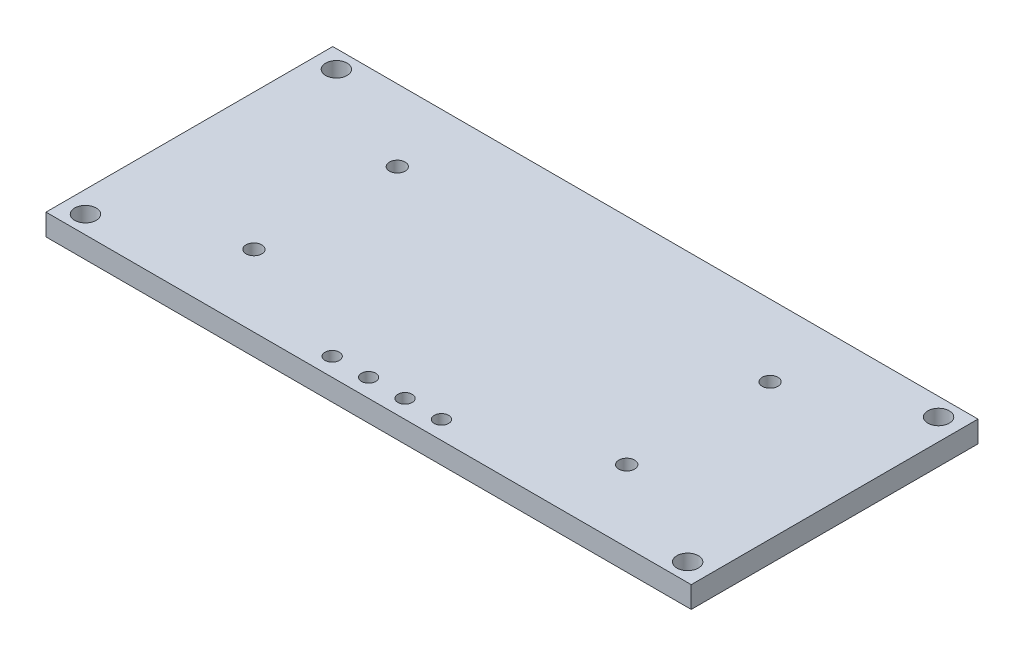
ISO-10303-21;
HEADER;
FILE_DESCRIPTION(('STEP AP214'),'2;1');
FILE_NAME('part.step','',(''),(''),'','','');
FILE_SCHEMA(('AUTOMOTIVE_DESIGN { 1 0 10303 214 1 1 1 1 }'));
ENDSEC;
DATA;
#1=APPLICATION_CONTEXT('core data for automotive mechanical design processes');
#2=APPLICATION_PROTOCOL_DEFINITION('international standard','automotive_design',2000,#1);
#3=PRODUCT_CONTEXT('',#1,'mechanical');
#4=PRODUCT('Part','Part','',(#3));
#5=PRODUCT_RELATED_PRODUCT_CATEGORY('part','',(#4));
#6=PRODUCT_DEFINITION_FORMATION('','',#4);
#7=PRODUCT_DEFINITION_CONTEXT('part definition',#1,'design');
#8=PRODUCT_DEFINITION('design','',#6,#7);
#9=PRODUCT_DEFINITION_SHAPE('','',#8);
#10=(LENGTH_UNIT() NAMED_UNIT(*) SI_UNIT(.MILLI.,.METRE.));
#11=(NAMED_UNIT(*) PLANE_ANGLE_UNIT() SI_UNIT($,.RADIAN.));
#12=(NAMED_UNIT(*) SI_UNIT($,.STERADIAN.) SOLID_ANGLE_UNIT());
#13=UNCERTAINTY_MEASURE_WITH_UNIT(LENGTH_MEASURE(1.E-05),#10,'distance_accuracy_value','');
#14=(GEOMETRIC_REPRESENTATION_CONTEXT(3) GLOBAL_UNCERTAINTY_ASSIGNED_CONTEXT((#13)) GLOBAL_UNIT_ASSIGNED_CONTEXT((#10,
#11,#12)) REPRESENTATION_CONTEXT('',''));
#15=CARTESIAN_POINT('',(0.,0.,0.));
#16=DIRECTION('',(0.,0.,1.));
#17=DIRECTION('',(1.,0.,0.));
#18=AXIS2_PLACEMENT_3D('',#15,#16,#17);
#19=CARTESIAN_POINT('',(0.,1.5,0.));
#20=DIRECTION('',(0.,1.,0.));
#21=DIRECTION('',(0.,0.,1.));
#22=AXIS2_PLACEMENT_3D('',#19,#20,#21);
#23=PLANE('',#22);
#24=CARTESIAN_POINT('',(-1.27,1.5,8.72999999999997));
#25=DIRECTION('',(0.,1.,0.));
#26=DIRECTION('',(0.,0.,1.));
#27=AXIS2_PLACEMENT_3D('',#24,#25,#26);
#28=CIRCLE('',#27,0.5);
#29=CARTESIAN_POINT('',(-1.27,1.5,9.22999999999997));
#30=VERTEX_POINT('',#29);
#31=EDGE_CURVE('E117',#30,#30,#28,.T.);
#32=ORIENTED_EDGE('',*,*,#31,.F.);
#33=EDGE_LOOP('',(#32));
#34=FACE_BOUND('',#33,.T.);
#35=CARTESIAN_POINT('',(1.27,1.5,8.72999999999997));
#36=DIRECTION('',(0.,1.,0.));
#37=DIRECTION('',(0.,0.,1.));
#38=AXIS2_PLACEMENT_3D('',#35,#36,#37);
#39=CIRCLE('',#38,0.5);
#40=CARTESIAN_POINT('',(1.27,1.5,9.22999999999997));
#41=VERTEX_POINT('',#40);
#42=EDGE_CURVE('E353',#41,#41,#39,.T.);
#43=ORIENTED_EDGE('',*,*,#42,.F.);
#44=EDGE_LOOP('',(#43));
#45=FACE_BOUND('',#44,.T.);
#46=CARTESIAN_POINT('',(3.81,1.5,8.72999999999997));
#47=DIRECTION('',(0.,1.,0.));
#48=DIRECTION('',(0.,0.,1.));
#49=AXIS2_PLACEMENT_3D('',#46,#47,#48);
#50=CIRCLE('',#49,0.500000000000002);
#51=CARTESIAN_POINT('',(3.81,1.5,9.22999999999997));
#52=VERTEX_POINT('',#51);
#53=EDGE_CURVE('E356',#52,#52,#50,.T.);
#54=ORIENTED_EDGE('',*,*,#53,.F.);
#55=EDGE_LOOP('',(#54));
#56=FACE_BOUND('',#55,.T.);
#57=CARTESIAN_POINT('',(13.,1.5,5.));
#58=DIRECTION('',(0.,1.,0.));
#59=DIRECTION('',(0.,0.,1.));
#60=AXIS2_PLACEMENT_3D('',#57,#58,#59);
#61=CIRCLE('',#60,0.55);
#62=CARTESIAN_POINT('',(13.,1.5,5.55));
#63=VERTEX_POINT('',#62);
#64=EDGE_CURVE('E361',#63,#63,#61,.T.);
#65=ORIENTED_EDGE('',*,*,#64,.F.);
#66=EDGE_LOOP('',(#65));
#67=FACE_BOUND('',#66,.T.);
#68=CARTESIAN_POINT('',(-13.,1.5,5.));
#69=DIRECTION('',(0.,1.,0.));
#70=DIRECTION('',(0.,0.,1.));
#71=AXIS2_PLACEMENT_3D('',#68,#69,#70);
#72=CIRCLE('',#71,0.55);
#73=CARTESIAN_POINT('',(-13.,1.5,5.55));
#74=VERTEX_POINT('',#73);
#75=EDGE_CURVE('E364',#74,#74,#72,.T.);
#76=ORIENTED_EDGE('',*,*,#75,.F.);
#77=EDGE_LOOP('',(#76));
#78=FACE_BOUND('',#77,.T.);
#79=CARTESIAN_POINT('',(-13.,1.5,-5.));
#80=DIRECTION('',(0.,1.,0.));
#81=DIRECTION('',(0.,0.,1.));
#82=AXIS2_PLACEMENT_3D('',#79,#80,#81);
#83=CIRCLE('',#82,0.55);
#84=CARTESIAN_POINT('',(-13.,1.5,-4.45));
#85=VERTEX_POINT('',#84);
#86=EDGE_CURVE('E366',#85,#85,#83,.T.);
#87=ORIENTED_EDGE('',*,*,#86,.F.);
#88=EDGE_LOOP('',(#87));
#89=FACE_BOUND('',#88,.T.);
#90=CARTESIAN_POINT('',(13.,1.5,-5.));
#91=DIRECTION('',(0.,1.,0.));
#92=DIRECTION('',(0.,0.,1.));
#93=AXIS2_PLACEMENT_3D('',#90,#91,#92);
#94=CIRCLE('',#93,0.55);
#95=CARTESIAN_POINT('',(13.,1.5,-4.45));
#96=VERTEX_POINT('',#95);
#97=EDGE_CURVE('E141',#96,#96,#94,.T.);
#98=ORIENTED_EDGE('',*,*,#97,.F.);
#99=EDGE_LOOP('',(#98));
#100=FACE_BOUND('',#99,.T.);
#101=CARTESIAN_POINT('',(-3.81,1.5,8.72999999999997));
#102=DIRECTION('',(0.,1.,0.));
#103=DIRECTION('',(0.,0.,1.));
#104=AXIS2_PLACEMENT_3D('',#101,#102,#103);
#105=CIRCLE('',#104,0.5);
#106=CARTESIAN_POINT('',(-3.81,1.5,9.22999999999997));
#107=VERTEX_POINT('',#106);
#108=EDGE_CURVE('E112',#107,#107,#105,.T.);
#109=ORIENTED_EDGE('',*,*,#108,.F.);
#110=EDGE_LOOP('',(#109));
#111=FACE_BOUND('',#110,.T.);
#112=CARTESIAN_POINT('',(21.0000000000001,1.5,8.74999999999995));
#113=DIRECTION('',(0.,1.,0.));
#114=DIRECTION('',(0.,0.,1.));
#115=AXIS2_PLACEMENT_3D('',#112,#113,#114);
#116=CIRCLE('',#115,0.750000000000002);
#117=CARTESIAN_POINT('',(21.0000000000001,1.5,9.49999999999995));
#118=VERTEX_POINT('',#117);
#119=EDGE_CURVE('E149',#118,#118,#116,.T.);
#120=ORIENTED_EDGE('',*,*,#119,.F.);
#121=EDGE_LOOP('',(#120));
#122=FACE_BOUND('',#121,.T.);
#123=CARTESIAN_POINT('',(-21.,1.5,-8.75000000000004));
#124=DIRECTION('',(0.,1.,0.));
#125=DIRECTION('',(0.,0.,1.));
#126=AXIS2_PLACEMENT_3D('',#123,#124,#125);
#127=CIRCLE('',#126,0.750000000000002);
#128=CARTESIAN_POINT('',(-21.,1.5,-8.00000000000004));
#129=VERTEX_POINT('',#128);
#130=EDGE_CURVE('E102',#129,#129,#127,.T.);
#131=ORIENTED_EDGE('',*,*,#130,.F.);
#132=EDGE_LOOP('',(#131));
#133=FACE_BOUND('',#132,.T.);
#134=DIRECTION('',(0.,0.,1.));
#135=VECTOR('',#134,1.);
#136=CARTESIAN_POINT('',(-22.5,1.5,9.99999999999998));
#137=LINE('',#136,#135);
#138=CARTESIAN_POINT('',(-22.5,1.5,-10.));
#139=VERTEX_POINT('',#138);
#140=CARTESIAN_POINT('',(-22.5,1.5,9.99999999999998));
#141=VERTEX_POINT('',#140);
#142=EDGE_CURVE('E86',#139,#141,#137,.T.);
#143=ORIENTED_EDGE('',*,*,#142,.T.);
#144=DIRECTION('',(1.,0.,0.));
#145=VECTOR('',#144,1.);
#146=CARTESIAN_POINT('',(22.5,1.5,9.99999999999997));
#147=LINE('',#146,#145);
#148=CARTESIAN_POINT('',(22.5,1.5,9.99999999999997));
#149=VERTEX_POINT('',#148);
#150=EDGE_CURVE('E81',#141,#149,#147,.T.);
#151=ORIENTED_EDGE('',*,*,#150,.T.);
#152=DIRECTION('',(0.,0.,-1.));
#153=VECTOR('',#152,1.);
#154=CARTESIAN_POINT('',(22.5,1.5,9.99999999999997));
#155=LINE('',#154,#153);
#156=CARTESIAN_POINT('',(22.5,1.5,-10.));
#157=VERTEX_POINT('',#156);
#158=EDGE_CURVE('E84',#149,#157,#155,.T.);
#159=ORIENTED_EDGE('',*,*,#158,.T.);
#160=DIRECTION('',(-1.,0.,0.));
#161=VECTOR('',#160,1.);
#162=CARTESIAN_POINT('',(22.5,1.5,-10.));
#163=LINE('',#162,#161);
#164=EDGE_CURVE('E51',#157,#139,#163,.T.);
#165=ORIENTED_EDGE('',*,*,#164,.T.);
#166=EDGE_LOOP('',(#143,#151,#159,#165));
#167=FACE_BOUND('',#166,.T.);
#168=CARTESIAN_POINT('',(-21.,1.5,8.74999999999996));
#169=DIRECTION('',(0.,1.,0.));
#170=DIRECTION('',(0.,0.,1.));
#171=AXIS2_PLACEMENT_3D('',#168,#169,#170);
#172=CIRCLE('',#171,0.750000000000002);
#173=CARTESIAN_POINT('',(-21.,1.5,9.49999999999996));
#174=VERTEX_POINT('',#173);
#175=EDGE_CURVE('E155',#174,#174,#172,.T.);
#176=ORIENTED_EDGE('',*,*,#175,.F.);
#177=EDGE_LOOP('',(#176));
#178=FACE_BOUND('',#177,.T.);
#179=CARTESIAN_POINT('',(21.0000000000001,1.5,-8.75000000000004));
#180=DIRECTION('',(0.,1.,0.));
#181=DIRECTION('',(0.,0.,1.));
#182=AXIS2_PLACEMENT_3D('',#179,#180,#181);
#183=CIRCLE('',#182,0.750000000000002);
#184=CARTESIAN_POINT('',(21.0000000000001,1.5,-8.00000000000004));
#185=VERTEX_POINT('',#184);
#186=EDGE_CURVE('E143',#185,#185,#183,.T.);
#187=ORIENTED_EDGE('',*,*,#186,.F.);
#188=EDGE_LOOP('',(#187));
#189=FACE_BOUND('',#188,.T.);
#190=ADVANCED_FACE('F32',(#34,#45,#56,#67,#78,#89,#100,#111,#122,#133,#167,#178,#189),#23,.T.);
#191=CARTESIAN_POINT('',(0.,0.,0.));
#192=DIRECTION('',(0.,1.,0.));
#193=DIRECTION('',(0.,0.,1.));
#194=AXIS2_PLACEMENT_3D('',#191,#192,#193);
#195=PLANE('',#194);
#196=CARTESIAN_POINT('',(-1.27,0.,8.72999999999997));
#197=DIRECTION('',(0.,1.,0.));
#198=DIRECTION('',(0.,0.,1.));
#199=AXIS2_PLACEMENT_3D('',#196,#197,#198);
#200=CIRCLE('',#199,0.5);
#201=CARTESIAN_POINT('',(-1.27,0.,9.22999999999997));
#202=VERTEX_POINT('',#201);
#203=EDGE_CURVE('E36',#202,#202,#200,.T.);
#204=ORIENTED_EDGE('',*,*,#203,.T.);
#205=EDGE_LOOP('',(#204));
#206=FACE_BOUND('',#205,.T.);
#207=CARTESIAN_POINT('',(1.27,0.,8.72999999999997));
#208=DIRECTION('',(0.,1.,0.));
#209=DIRECTION('',(0.,0.,1.));
#210=AXIS2_PLACEMENT_3D('',#207,#208,#209);
#211=CIRCLE('',#210,0.5);
#212=CARTESIAN_POINT('',(1.27,0.,9.22999999999997));
#213=VERTEX_POINT('',#212);
#214=EDGE_CURVE('E128',#213,#213,#211,.T.);
#215=ORIENTED_EDGE('',*,*,#214,.T.);
#216=EDGE_LOOP('',(#215));
#217=FACE_BOUND('',#216,.T.);
#218=CARTESIAN_POINT('',(3.81,0.,8.72999999999997));
#219=DIRECTION('',(0.,1.,0.));
#220=DIRECTION('',(0.,0.,1.));
#221=AXIS2_PLACEMENT_3D('',#218,#219,#220);
#222=CIRCLE('',#221,0.500000000000002);
#223=CARTESIAN_POINT('',(3.81,0.,9.22999999999997));
#224=VERTEX_POINT('',#223);
#225=EDGE_CURVE('E126',#224,#224,#222,.T.);
#226=ORIENTED_EDGE('',*,*,#225,.T.);
#227=EDGE_LOOP('',(#226));
#228=FACE_BOUND('',#227,.T.);
#229=CARTESIAN_POINT('',(13.,0.,5.));
#230=DIRECTION('',(0.,1.,0.));
#231=DIRECTION('',(0.,0.,1.));
#232=AXIS2_PLACEMENT_3D('',#229,#230,#231);
#233=CIRCLE('',#232,0.55);
#234=CARTESIAN_POINT('',(13.,0.,5.55));
#235=VERTEX_POINT('',#234);
#236=EDGE_CURVE('E123',#235,#235,#233,.T.);
#237=ORIENTED_EDGE('',*,*,#236,.T.);
#238=EDGE_LOOP('',(#237));
#239=FACE_BOUND('',#238,.T.);
#240=CARTESIAN_POINT('',(-13.,0.,5.));
#241=DIRECTION('',(0.,1.,0.));
#242=DIRECTION('',(0.,0.,1.));
#243=AXIS2_PLACEMENT_3D('',#240,#241,#242);
#244=CIRCLE('',#243,0.55);
#245=CARTESIAN_POINT('',(-13.,0.,5.55));
#246=VERTEX_POINT('',#245);
#247=EDGE_CURVE('E120',#246,#246,#244,.T.);
#248=ORIENTED_EDGE('',*,*,#247,.T.);
#249=EDGE_LOOP('',(#248));
#250=FACE_BOUND('',#249,.T.);
#251=CARTESIAN_POINT('',(-13.,0.,-5.));
#252=DIRECTION('',(0.,1.,0.));
#253=DIRECTION('',(0.,0.,1.));
#254=AXIS2_PLACEMENT_3D('',#251,#252,#253);
#255=CIRCLE('',#254,0.55);
#256=CARTESIAN_POINT('',(-13.,0.,-4.45));
#257=VERTEX_POINT('',#256);
#258=EDGE_CURVE('E116',#257,#257,#255,.T.);
#259=ORIENTED_EDGE('',*,*,#258,.T.);
#260=EDGE_LOOP('',(#259));
#261=FACE_BOUND('',#260,.T.);
#262=CARTESIAN_POINT('',(13.,0.,-5.));
#263=DIRECTION('',(0.,1.,0.));
#264=DIRECTION('',(0.,0.,1.));
#265=AXIS2_PLACEMENT_3D('',#262,#263,#264);
#266=CIRCLE('',#265,0.55);
#267=CARTESIAN_POINT('',(13.,0.,-4.45));
#268=VERTEX_POINT('',#267);
#269=EDGE_CURVE('E113',#268,#268,#266,.T.);
#270=ORIENTED_EDGE('',*,*,#269,.T.);
#271=EDGE_LOOP('',(#270));
#272=FACE_BOUND('',#271,.T.);
#273=CARTESIAN_POINT('',(-3.81,0.,8.72999999999997));
#274=DIRECTION('',(0.,1.,0.));
#275=DIRECTION('',(0.,0.,1.));
#276=AXIS2_PLACEMENT_3D('',#273,#274,#275);
#277=CIRCLE('',#276,0.5);
#278=CARTESIAN_POINT('',(-3.81,0.,9.22999999999997));
#279=VERTEX_POINT('',#278);
#280=EDGE_CURVE('E108',#279,#279,#277,.T.);
#281=ORIENTED_EDGE('',*,*,#280,.T.);
#282=EDGE_LOOP('',(#281));
#283=FACE_BOUND('',#282,.T.);
#284=DIRECTION('',(0.,0.,1.));
#285=VECTOR('',#284,1.);
#286=CARTESIAN_POINT('',(-22.5,0.,9.99999999999998));
#287=LINE('',#286,#285);
#288=CARTESIAN_POINT('',(-22.5,0.,-10.));
#289=VERTEX_POINT('',#288);
#290=CARTESIAN_POINT('',(-22.5,0.,9.99999999999998));
#291=VERTEX_POINT('',#290);
#292=EDGE_CURVE('E99',#289,#291,#287,.T.);
#293=ORIENTED_EDGE('',*,*,#292,.F.);
#294=DIRECTION('',(-1.,0.,0.));
#295=VECTOR('',#294,1.);
#296=CARTESIAN_POINT('',(22.5,0.,-10.));
#297=LINE('',#296,#295);
#298=CARTESIAN_POINT('',(22.5,0.,-10.));
#299=VERTEX_POINT('',#298);
#300=EDGE_CURVE('E74',#299,#289,#297,.T.);
#301=ORIENTED_EDGE('',*,*,#300,.F.);
#302=DIRECTION('',(0.,0.,-1.));
#303=VECTOR('',#302,1.);
#304=CARTESIAN_POINT('',(22.5,0.,9.99999999999997));
#305=LINE('',#304,#303);
#306=CARTESIAN_POINT('',(22.5,0.,9.99999999999997));
#307=VERTEX_POINT('',#306);
#308=EDGE_CURVE('E68',#307,#299,#305,.T.);
#309=ORIENTED_EDGE('',*,*,#308,.F.);
#310=DIRECTION('',(1.,0.,0.));
#311=VECTOR('',#310,1.);
#312=CARTESIAN_POINT('',(22.5,0.,9.99999999999997));
#313=LINE('',#312,#311);
#314=EDGE_CURVE('E90',#291,#307,#313,.T.);
#315=ORIENTED_EDGE('',*,*,#314,.F.);
#316=EDGE_LOOP('',(#293,#301,#309,#315));
#317=FACE_BOUND('',#316,.T.);
#318=CARTESIAN_POINT('',(-21.,0.,-8.75000000000004));
#319=DIRECTION('',(0.,1.,0.));
#320=DIRECTION('',(0.,0.,1.));
#321=AXIS2_PLACEMENT_3D('',#318,#319,#320);
#322=CIRCLE('',#321,0.750000000000002);
#323=CARTESIAN_POINT('',(-21.,0.,-8.00000000000004));
#324=VERTEX_POINT('',#323);
#325=EDGE_CURVE('E158',#324,#324,#322,.T.);
#326=ORIENTED_EDGE('',*,*,#325,.T.);
#327=EDGE_LOOP('',(#326));
#328=FACE_BOUND('',#327,.T.);
#329=CARTESIAN_POINT('',(-21.,0.,8.74999999999996));
#330=DIRECTION('',(0.,1.,0.));
#331=DIRECTION('',(0.,0.,1.));
#332=AXIS2_PLACEMENT_3D('',#329,#330,#331);
#333=CIRCLE('',#332,0.750000000000002);
#334=CARTESIAN_POINT('',(-21.,0.,9.49999999999996));
#335=VERTEX_POINT('',#334);
#336=EDGE_CURVE('E152',#335,#335,#333,.T.);
#337=ORIENTED_EDGE('',*,*,#336,.T.);
#338=EDGE_LOOP('',(#337));
#339=FACE_BOUND('',#338,.T.);
#340=CARTESIAN_POINT('',(21.0000000000001,0.,8.74999999999995));
#341=DIRECTION('',(0.,1.,0.));
#342=DIRECTION('',(0.,0.,1.));
#343=AXIS2_PLACEMENT_3D('',#340,#341,#342);
#344=CIRCLE('',#343,0.750000000000002);
#345=CARTESIAN_POINT('',(21.0000000000001,0.,9.49999999999995));
#346=VERTEX_POINT('',#345);
#347=EDGE_CURVE('E146',#346,#346,#344,.T.);
#348=ORIENTED_EDGE('',*,*,#347,.T.);
#349=EDGE_LOOP('',(#348));
#350=FACE_BOUND('',#349,.T.);
#351=CARTESIAN_POINT('',(21.0000000000001,0.,-8.75000000000004));
#352=DIRECTION('',(0.,1.,0.));
#353=DIRECTION('',(0.,0.,1.));
#354=AXIS2_PLACEMENT_3D('',#351,#352,#353);
#355=CIRCLE('',#354,0.750000000000002);
#356=CARTESIAN_POINT('',(21.0000000000001,0.,-8.00000000000004));
#357=VERTEX_POINT('',#356);
#358=EDGE_CURVE('E111',#357,#357,#355,.T.);
#359=ORIENTED_EDGE('',*,*,#358,.T.);
#360=EDGE_LOOP('',(#359));
#361=FACE_BOUND('',#360,.T.);
#362=ADVANCED_FACE('F166',(#206,#217,#228,#239,#250,#261,#272,#283,#317,#328,#339,#350,#361),
#195,.F.);
#363=CARTESIAN_POINT('',(-22.5,1.5,9.99999999999998));
#364=DIRECTION('',(1.,0.,0.));
#365=DIRECTION('',(0.,0.,-1.));
#366=AXIS2_PLACEMENT_3D('',#363,#364,#365);
#367=PLANE('',#366);
#368=ORIENTED_EDGE('',*,*,#292,.T.);
#369=DIRECTION('',(0.,-1.,0.));
#370=VECTOR('',#369,1.);
#371=CARTESIAN_POINT('',(-22.5,1.5,9.99999999999998));
#372=LINE('',#371,#370);
#373=EDGE_CURVE('E11',#141,#291,#372,.T.);
#374=ORIENTED_EDGE('',*,*,#373,.F.);
#375=ORIENTED_EDGE('',*,*,#142,.F.);
#376=DIRECTION('',(0.,-1.,0.));
#377=VECTOR('',#376,1.);
#378=CARTESIAN_POINT('',(-22.5,1.5,-10.));
#379=LINE('',#378,#377);
#380=EDGE_CURVE('E95',#139,#289,#379,.T.);
#381=ORIENTED_EDGE('',*,*,#380,.T.);
#382=EDGE_LOOP('',(#368,#374,#375,#381));
#383=FACE_BOUND('',#382,.T.);
#384=ADVANCED_FACE('F34',(#383),#367,.F.);
#385=CARTESIAN_POINT('',(22.5,1.5,9.99999999999997));
#386=DIRECTION('',(0.,0.,-1.));
#387=DIRECTION('',(-1.,0.,0.));
#388=AXIS2_PLACEMENT_3D('',#385,#386,#387);
#389=PLANE('',#388);
#390=ORIENTED_EDGE('',*,*,#314,.T.);
#391=DIRECTION('',(0.,-1.,0.));
#392=VECTOR('',#391,1.);
#393=CARTESIAN_POINT('',(22.5,1.5,9.99999999999997));
#394=LINE('',#393,#392);
#395=EDGE_CURVE('E42',#149,#307,#394,.T.);
#396=ORIENTED_EDGE('',*,*,#395,.F.);
#397=ORIENTED_EDGE('',*,*,#150,.F.);
#398=ORIENTED_EDGE('',*,*,#373,.T.);
#399=EDGE_LOOP('',(#390,#396,#397,#398));
#400=FACE_BOUND('',#399,.T.);
#401=ADVANCED_FACE('F89',(#400),#389,.F.);
#402=CARTESIAN_POINT('',(22.5,1.5,9.99999999999997));
#403=DIRECTION('',(-1.,0.,0.));
#404=DIRECTION('',(0.,0.,1.));
#405=AXIS2_PLACEMENT_3D('',#402,#403,#404);
#406=PLANE('',#405);
#407=ORIENTED_EDGE('',*,*,#308,.T.);
#408=DIRECTION('',(0.,-1.,0.));
#409=VECTOR('',#408,1.);
#410=CARTESIAN_POINT('',(22.5,1.5,-10.));
#411=LINE('',#410,#409);
#412=EDGE_CURVE('E91',#157,#299,#411,.T.);
#413=ORIENTED_EDGE('',*,*,#412,.F.);
#414=ORIENTED_EDGE('',*,*,#158,.F.);
#415=ORIENTED_EDGE('',*,*,#395,.T.);
#416=EDGE_LOOP('',(#407,#413,#414,#415));
#417=FACE_BOUND('',#416,.T.);
#418=ADVANCED_FACE('F93',(#417),#406,.F.);
#419=CARTESIAN_POINT('',(22.5,1.5,-10.));
#420=DIRECTION('',(0.,0.,1.));
#421=DIRECTION('',(1.,0.,0.));
#422=AXIS2_PLACEMENT_3D('',#419,#420,#421);
#423=PLANE('',#422);
#424=ORIENTED_EDGE('',*,*,#300,.T.);
#425=ORIENTED_EDGE('',*,*,#380,.F.);
#426=ORIENTED_EDGE('',*,*,#164,.F.);
#427=ORIENTED_EDGE('',*,*,#412,.T.);
#428=EDGE_LOOP('',(#424,#425,#426,#427));
#429=FACE_BOUND('',#428,.T.);
#430=ADVANCED_FACE('F172',(#429),#423,.F.);
#431=CARTESIAN_POINT('',(-21.,1.5,-8.75000000000004));
#432=DIRECTION('',(0.,-1.,0.));
#433=DIRECTION('',(0.,0.,-1.));
#434=AXIS2_PLACEMENT_3D('',#431,#432,#433);
#435=CYLINDRICAL_SURFACE('',#434,0.750000000000002);
#436=ORIENTED_EDGE('',*,*,#130,.T.);
#437=EDGE_LOOP('',(#436));
#438=FACE_BOUND('',#437,.T.);
#439=ORIENTED_EDGE('',*,*,#325,.F.);
#440=EDGE_LOOP('',(#439));
#441=FACE_BOUND('',#440,.T.);
#442=ADVANCED_FACE('F169',(#438,#441),#435,.F.);
#443=CARTESIAN_POINT('',(-21.,1.5,8.74999999999996));
#444=DIRECTION('',(0.,-1.,0.));
#445=DIRECTION('',(0.,0.,-1.));
#446=AXIS2_PLACEMENT_3D('',#443,#444,#445);
#447=CYLINDRICAL_SURFACE('',#446,0.750000000000002);
#448=ORIENTED_EDGE('',*,*,#175,.T.);
#449=EDGE_LOOP('',(#448));
#450=FACE_BOUND('',#449,.T.);
#451=ORIENTED_EDGE('',*,*,#336,.F.);
#452=EDGE_LOOP('',(#451));
#453=FACE_BOUND('',#452,.T.);
#454=ADVANCED_FACE('F171',(#450,#453),#447,.F.);
#455=CARTESIAN_POINT('',(21.0000000000001,1.5,8.74999999999995));
#456=DIRECTION('',(0.,-1.,0.));
#457=DIRECTION('',(0.,0.,-1.));
#458=AXIS2_PLACEMENT_3D('',#455,#456,#457);
#459=CYLINDRICAL_SURFACE('',#458,0.750000000000002);
#460=ORIENTED_EDGE('',*,*,#119,.T.);
#461=EDGE_LOOP('',(#460));
#462=FACE_BOUND('',#461,.T.);
#463=ORIENTED_EDGE('',*,*,#347,.F.);
#464=EDGE_LOOP('',(#463));
#465=FACE_BOUND('',#464,.T.);
#466=ADVANCED_FACE('F179',(#462,#465),#459,.F.);
#467=CARTESIAN_POINT('',(21.0000000000001,1.5,-8.75000000000004));
#468=DIRECTION('',(0.,-1.,0.));
#469=DIRECTION('',(0.,0.,-1.));
#470=AXIS2_PLACEMENT_3D('',#467,#468,#469);
#471=CYLINDRICAL_SURFACE('',#470,0.750000000000002);
#472=ORIENTED_EDGE('',*,*,#186,.T.);
#473=EDGE_LOOP('',(#472));
#474=FACE_BOUND('',#473,.T.);
#475=ORIENTED_EDGE('',*,*,#358,.F.);
#476=EDGE_LOOP('',(#475));
#477=FACE_BOUND('',#476,.T.);
#478=ADVANCED_FACE('F221',(#474,#477),#471,.F.);
#479=CARTESIAN_POINT('',(-3.81,-0.5,8.72999999999997));
#480=DIRECTION('',(0.,1.,0.));
#481=DIRECTION('',(0.,0.,1.));
#482=AXIS2_PLACEMENT_3D('',#479,#480,#481);
#483=CYLINDRICAL_SURFACE('',#482,0.5);
#484=ORIENTED_EDGE('',*,*,#108,.T.);
#485=EDGE_LOOP('',(#484));
#486=FACE_BOUND('',#485,.T.);
#487=ORIENTED_EDGE('',*,*,#280,.F.);
#488=EDGE_LOOP('',(#487));
#489=FACE_BOUND('',#488,.T.);
#490=ADVANCED_FACE('F215',(#486,#489),#483,.F.);
#491=CARTESIAN_POINT('',(13.,-0.5,-5.));
#492=DIRECTION('',(0.,1.,0.));
#493=DIRECTION('',(0.,0.,1.));
#494=AXIS2_PLACEMENT_3D('',#491,#492,#493);
#495=CYLINDRICAL_SURFACE('',#494,0.55);
#496=ORIENTED_EDGE('',*,*,#97,.T.);
#497=EDGE_LOOP('',(#496));
#498=FACE_BOUND('',#497,.T.);
#499=ORIENTED_EDGE('',*,*,#269,.F.);
#500=EDGE_LOOP('',(#499));
#501=FACE_BOUND('',#500,.T.);
#502=ADVANCED_FACE('F220',(#498,#501),#495,.F.);
#503=CARTESIAN_POINT('',(-13.,-0.5,-5.));
#504=DIRECTION('',(0.,1.,0.));
#505=DIRECTION('',(0.,0.,1.));
#506=AXIS2_PLACEMENT_3D('',#503,#504,#505);
#507=CYLINDRICAL_SURFACE('',#506,0.55);
#508=ORIENTED_EDGE('',*,*,#86,.T.);
#509=EDGE_LOOP('',(#508));
#510=FACE_BOUND('',#509,.T.);
#511=ORIENTED_EDGE('',*,*,#258,.F.);
#512=EDGE_LOOP('',(#511));
#513=FACE_BOUND('',#512,.T.);
#514=ADVANCED_FACE('F232',(#510,#513),#507,.F.);
#515=CARTESIAN_POINT('',(-13.,-0.5,5.));
#516=DIRECTION('',(0.,1.,0.));
#517=DIRECTION('',(0.,0.,1.));
#518=AXIS2_PLACEMENT_3D('',#515,#516,#517);
#519=CYLINDRICAL_SURFACE('',#518,0.55);
#520=ORIENTED_EDGE('',*,*,#75,.T.);
#521=EDGE_LOOP('',(#520));
#522=FACE_BOUND('',#521,.T.);
#523=ORIENTED_EDGE('',*,*,#247,.F.);
#524=EDGE_LOOP('',(#523));
#525=FACE_BOUND('',#524,.T.);
#526=ADVANCED_FACE('F242',(#522,#525),#519,.F.);
#527=CARTESIAN_POINT('',(13.,-0.5,5.));
#528=DIRECTION('',(0.,1.,0.));
#529=DIRECTION('',(0.,0.,1.));
#530=AXIS2_PLACEMENT_3D('',#527,#528,#529);
#531=CYLINDRICAL_SURFACE('',#530,0.55);
#532=ORIENTED_EDGE('',*,*,#64,.T.);
#533=EDGE_LOOP('',(#532));
#534=FACE_BOUND('',#533,.T.);
#535=ORIENTED_EDGE('',*,*,#236,.F.);
#536=EDGE_LOOP('',(#535));
#537=FACE_BOUND('',#536,.T.);
#538=ADVANCED_FACE('F252',(#534,#537),#531,.F.);
#539=CARTESIAN_POINT('',(3.81,-0.5,8.72999999999997));
#540=DIRECTION('',(0.,1.,0.));
#541=DIRECTION('',(0.,0.,1.));
#542=AXIS2_PLACEMENT_3D('',#539,#540,#541);
#543=CYLINDRICAL_SURFACE('',#542,0.500000000000002);
#544=ORIENTED_EDGE('',*,*,#53,.T.);
#545=EDGE_LOOP('',(#544));
#546=FACE_BOUND('',#545,.T.);
#547=ORIENTED_EDGE('',*,*,#225,.F.);
#548=EDGE_LOOP('',(#547));
#549=FACE_BOUND('',#548,.T.);
#550=ADVANCED_FACE('F262',(#546,#549),#543,.F.);
#551=CARTESIAN_POINT('',(1.27,-0.5,8.72999999999997));
#552=DIRECTION('',(0.,1.,0.));
#553=DIRECTION('',(0.,0.,1.));
#554=AXIS2_PLACEMENT_3D('',#551,#552,#553);
#555=CYLINDRICAL_SURFACE('',#554,0.5);
#556=ORIENTED_EDGE('',*,*,#42,.T.);
#557=EDGE_LOOP('',(#556));
#558=FACE_BOUND('',#557,.T.);
#559=ORIENTED_EDGE('',*,*,#214,.F.);
#560=EDGE_LOOP('',(#559));
#561=FACE_BOUND('',#560,.T.);
#562=ADVANCED_FACE('F272',(#558,#561),#555,.F.);
#563=CARTESIAN_POINT('',(-1.27,-0.5,8.72999999999997));
#564=DIRECTION('',(0.,1.,0.));
#565=DIRECTION('',(0.,0.,1.));
#566=AXIS2_PLACEMENT_3D('',#563,#564,#565);
#567=CYLINDRICAL_SURFACE('',#566,0.5);
#568=ORIENTED_EDGE('',*,*,#31,.T.);
#569=EDGE_LOOP('',(#568));
#570=FACE_BOUND('',#569,.T.);
#571=ORIENTED_EDGE('',*,*,#203,.F.);
#572=EDGE_LOOP('',(#571));
#573=FACE_BOUND('',#572,.T.);
#574=ADVANCED_FACE('F282',(#570,#573),#567,.F.);
#575=CLOSED_SHELL('',(#190,#362,#384,#401,#418,#430,#442,#454,#466,#478,#490,#502,#514,#526,
#538,#550,#562,#574));
#576=MANIFOLD_SOLID_BREP('B2',#575);
#577=ADVANCED_BREP_SHAPE_REPRESENTATION('',(#18,#576),#14);
#578=SHAPE_DEFINITION_REPRESENTATION(#9,#577);
ENDSEC;
END-ISO-10303-21;
